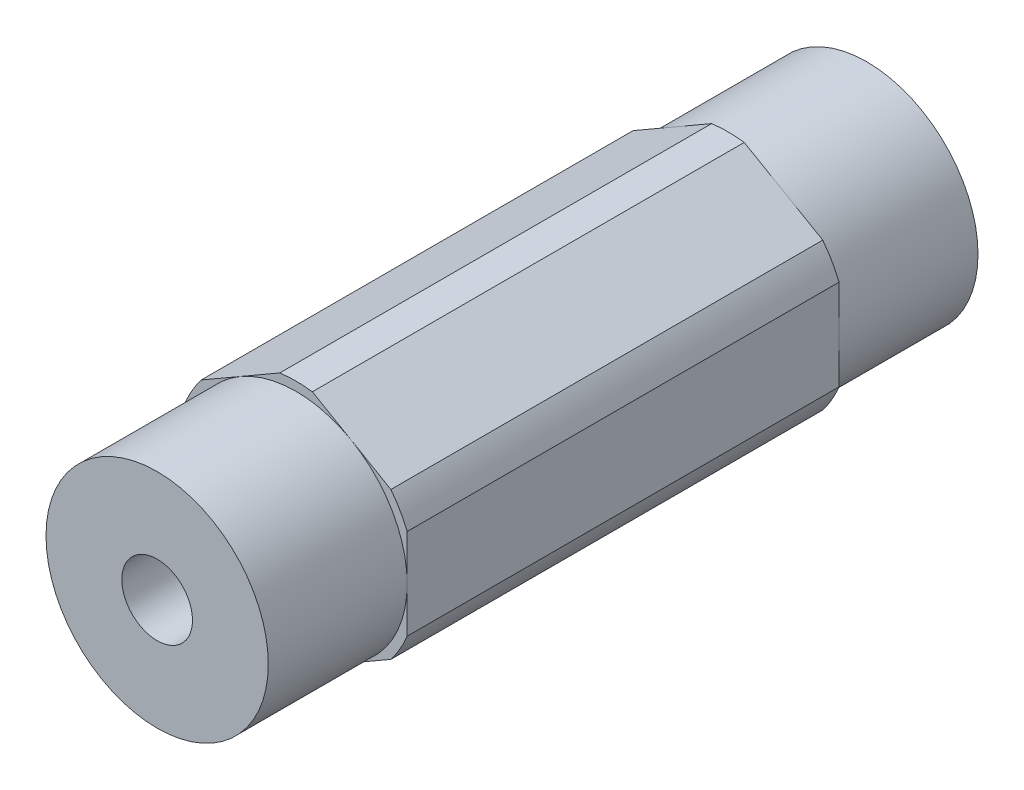
ISO-10303-21;
HEADER;
FILE_DESCRIPTION(('STEP AP214'),'2;1');
FILE_NAME('part.step','',(''),(''),'','','');
FILE_SCHEMA(('AUTOMOTIVE_DESIGN { 1 0 10303 214 1 1 1 1 }'));
ENDSEC;
DATA;
#1=APPLICATION_CONTEXT('core data for automotive mechanical design processes');
#2=APPLICATION_PROTOCOL_DEFINITION('international standard','automotive_design',2000,#1);
#3=PRODUCT_CONTEXT('',#1,'mechanical');
#4=PRODUCT('Part','Part','',(#3));
#5=PRODUCT_RELATED_PRODUCT_CATEGORY('part','',(#4));
#6=PRODUCT_DEFINITION_FORMATION('','',#4);
#7=PRODUCT_DEFINITION_CONTEXT('part definition',#1,'design');
#8=PRODUCT_DEFINITION('design','',#6,#7);
#9=PRODUCT_DEFINITION_SHAPE('','',#8);
#10=(LENGTH_UNIT() NAMED_UNIT(*) SI_UNIT(.MILLI.,.METRE.));
#11=(NAMED_UNIT(*) PLANE_ANGLE_UNIT() SI_UNIT($,.RADIAN.));
#12=(NAMED_UNIT(*) SI_UNIT($,.STERADIAN.) SOLID_ANGLE_UNIT());
#13=UNCERTAINTY_MEASURE_WITH_UNIT(LENGTH_MEASURE(1.E-05),#10,'distance_accuracy_value','');
#14=(GEOMETRIC_REPRESENTATION_CONTEXT(3) GLOBAL_UNCERTAINTY_ASSIGNED_CONTEXT((#13)) GLOBAL_UNIT_ASSIGNED_CONTEXT((#10,
#11,#12)) REPRESENTATION_CONTEXT('',''));
#15=CARTESIAN_POINT('',(0.,0.,0.));
#16=DIRECTION('',(0.,0.,1.));
#17=DIRECTION('',(1.,0.,0.));
#18=AXIS2_PLACEMENT_3D('',#15,#16,#17);
#19=CARTESIAN_POINT('',(0.,0.,-12.337299938));
#20=DIRECTION('',(0.,0.,1.));
#21=DIRECTION('',(1.,0.,0.));
#22=AXIS2_PLACEMENT_3D('',#19,#20,#21);
#23=PLANE('',#22);
#24=DIRECTION('',(0.,1.,0.));
#25=VECTOR('',#24,1.);
#26=CARTESIAN_POINT('',(6.35,0.,-12.337299938));
#27=LINE('',#26,#25);
#28=CARTESIAN_POINT('',(6.35,0.,-12.337299938));
#29=VERTEX_POINT('',#28);
#30=CARTESIAN_POINT('',(6.35,2.59030191290514,-12.337299938));
#31=VERTEX_POINT('',#30);
#32=EDGE_CURVE('E219',#29,#31,#27,.T.);
#33=ORIENTED_EDGE('',*,*,#32,.F.);
#34=CARTESIAN_POINT('',(0.,0.,-12.337299938));
#35=DIRECTION('',(0.,0.,1.));
#36=DIRECTION('',(1.,0.,0.));
#37=AXIS2_PLACEMENT_3D('',#34,#35,#36);
#38=CIRCLE('',#37,6.35);
#39=CARTESIAN_POINT('',(3.175,5.49926131403118,-12.337299938));
#40=VERTEX_POINT('',#39);
#41=EDGE_CURVE('E63',#29,#40,#38,.T.);
#42=ORIENTED_EDGE('',*,*,#41,.T.);
#43=DIRECTION('',(-0.866025403784439,0.5,0.));
#44=VECTOR('',#43,1.);
#45=CARTESIAN_POINT('',(3.175,5.49926131403119,-12.337299938));
#46=LINE('',#45,#44);
#47=CARTESIAN_POINT('',(5.41826726004727,4.20411035757862,-12.337299938));
#48=VERTEX_POINT('',#47);
#49=EDGE_CURVE('E271',#48,#40,#46,.T.);
#50=ORIENTED_EDGE('',*,*,#49,.F.);
#51=CARTESIAN_POINT('',(0.,0.,-12.337299938));
#52=DIRECTION('',(0.,0.,1.));
#53=DIRECTION('',(1.,0.,0.));
#54=AXIS2_PLACEMENT_3D('',#51,#52,#53);
#55=CIRCLE('',#54,6.858);
#56=EDGE_CURVE('E265',#31,#48,#55,.T.);
#57=ORIENTED_EDGE('',*,*,#56,.F.);
#58=EDGE_LOOP('',(#33,#42,#50,#57));
#59=FACE_BOUND('',#58,.T.);
#60=ADVANCED_FACE('F51',(#59),#23,.F.);
#61=CARTESIAN_POINT('',(0.931732739952729,6.79441227048375,-12.337299938));
#62=VERTEX_POINT('',#61);
#63=EDGE_CURVE('E268',#40,#62,#46,.T.);
#64=ORIENTED_EDGE('',*,*,#63,.F.);
#65=CARTESIAN_POINT('',(-3.175,5.49926131403118,-12.337299938));
#66=VERTEX_POINT('',#65);
#67=EDGE_CURVE('E11',#40,#66,#38,.T.);
#68=ORIENTED_EDGE('',*,*,#67,.T.);
#69=DIRECTION('',(-0.866025403784438,-0.5,0.));
#70=VECTOR('',#69,1.);
#71=CARTESIAN_POINT('',(-3.175,5.49926131403118,-12.337299938));
#72=LINE('',#71,#70);
#73=CARTESIAN_POINT('',(-0.931732739952722,6.79441227048375,-12.337299938));
#74=VERTEX_POINT('',#73);
#75=EDGE_CURVE('E275',#74,#66,#72,.T.);
#76=ORIENTED_EDGE('',*,*,#75,.F.);
#77=EDGE_CURVE('E270',#62,#74,#55,.T.);
#78=ORIENTED_EDGE('',*,*,#77,.F.);
#79=EDGE_LOOP('',(#64,#68,#76,#78));
#80=FACE_BOUND('',#79,.T.);
#81=ADVANCED_FACE('F437',(#80),#23,.F.);
#82=CARTESIAN_POINT('',(-5.41826726004728,4.20411035757861,-12.337299938));
#83=VERTEX_POINT('',#82);
#84=EDGE_CURVE('E280',#66,#83,#72,.T.);
#85=ORIENTED_EDGE('',*,*,#84,.F.);
#86=CARTESIAN_POINT('',(-6.35,0.,-12.337299938));
#87=VERTEX_POINT('',#86);
#88=EDGE_CURVE('E61',#66,#87,#38,.T.);
#89=ORIENTED_EDGE('',*,*,#88,.T.);
#90=DIRECTION('',(0.,-1.,0.));
#91=VECTOR('',#90,1.);
#92=CARTESIAN_POINT('',(-6.35,0.,-12.337299938));
#93=LINE('',#92,#91);
#94=CARTESIAN_POINT('',(-6.35,2.59030191290514,-12.337299938));
#95=VERTEX_POINT('',#94);
#96=EDGE_CURVE('E281',#95,#87,#93,.T.);
#97=ORIENTED_EDGE('',*,*,#96,.F.);
#98=EDGE_CURVE('E279',#83,#95,#55,.T.);
#99=ORIENTED_EDGE('',*,*,#98,.F.);
#100=EDGE_LOOP('',(#85,#89,#97,#99));
#101=FACE_BOUND('',#100,.T.);
#102=ADVANCED_FACE('F384',(#101),#23,.F.);
#103=CARTESIAN_POINT('',(-6.35,-2.59030191290514,-12.337299938));
#104=VERTEX_POINT('',#103);
#105=EDGE_CURVE('E286',#87,#104,#93,.T.);
#106=ORIENTED_EDGE('',*,*,#105,.F.);
#107=CARTESIAN_POINT('',(-3.175,-5.49926131403119,-12.337299938));
#108=VERTEX_POINT('',#107);
#109=EDGE_CURVE('E370',#87,#108,#38,.T.);
#110=ORIENTED_EDGE('',*,*,#109,.T.);
#111=DIRECTION('',(0.866025403784439,-0.5,0.));
#112=VECTOR('',#111,1.);
#113=CARTESIAN_POINT('',(-3.175,-5.49926131403119,-12.337299938));
#114=LINE('',#113,#112);
#115=CARTESIAN_POINT('',(-5.41826726004727,-4.20411035757862,-12.337299938));
#116=VERTEX_POINT('',#115);
#117=EDGE_CURVE('E287',#116,#108,#114,.T.);
#118=ORIENTED_EDGE('',*,*,#117,.F.);
#119=EDGE_CURVE('E285',#104,#116,#55,.T.);
#120=ORIENTED_EDGE('',*,*,#119,.F.);
#121=EDGE_LOOP('',(#106,#110,#118,#120));
#122=FACE_BOUND('',#121,.T.);
#123=ADVANCED_FACE('F387',(#122),#23,.F.);
#124=CARTESIAN_POINT('',(-0.931732739952726,-6.79441227048375,-12.337299938));
#125=VERTEX_POINT('',#124);
#126=EDGE_CURVE('E292',#108,#125,#114,.T.);
#127=ORIENTED_EDGE('',*,*,#126,.F.);
#128=CARTESIAN_POINT('',(3.175,-5.49926131403118,-12.337299938));
#129=VERTEX_POINT('',#128);
#130=EDGE_CURVE('E363',#108,#129,#38,.T.);
#131=ORIENTED_EDGE('',*,*,#130,.T.);
#132=DIRECTION('',(0.866025403784438,0.5,0.));
#133=VECTOR('',#132,1.);
#134=CARTESIAN_POINT('',(3.175,-5.49926131403118,-12.337299938));
#135=LINE('',#134,#133);
#136=CARTESIAN_POINT('',(0.931732739952725,-6.79441227048375,-12.337299938));
#137=VERTEX_POINT('',#136);
#138=EDGE_CURVE('E293',#137,#129,#135,.T.);
#139=ORIENTED_EDGE('',*,*,#138,.F.);
#140=EDGE_CURVE('E291',#125,#137,#55,.T.);
#141=ORIENTED_EDGE('',*,*,#140,.F.);
#142=EDGE_LOOP('',(#127,#131,#139,#141));
#143=FACE_BOUND('',#142,.T.);
#144=ADVANCED_FACE('F466',(#143),#23,.F.);
#145=CARTESIAN_POINT('',(0.,0.,12.337299938));
#146=DIRECTION('',(0.,0.,1.));
#147=DIRECTION('',(1.,0.,0.));
#148=AXIS2_PLACEMENT_3D('',#145,#146,#147);
#149=PLANE('',#148);
#150=CARTESIAN_POINT('',(0.,0.,12.337299938));
#151=DIRECTION('',(0.,0.,1.));
#152=DIRECTION('',(1.,0.,0.));
#153=AXIS2_PLACEMENT_3D('',#150,#151,#152);
#154=CIRCLE('',#153,6.35);
#155=CARTESIAN_POINT('',(6.35,0.,12.337299938));
#156=VERTEX_POINT('',#155);
#157=CARTESIAN_POINT('',(3.175,5.49926131403119,12.337299938));
#158=VERTEX_POINT('',#157);
#159=EDGE_CURVE('E211',#156,#158,#154,.T.);
#160=ORIENTED_EDGE('',*,*,#159,.F.);
#161=DIRECTION('',(0.,1.,0.));
#162=VECTOR('',#161,1.);
#163=CARTESIAN_POINT('',(6.35,0.,12.337299938));
#164=LINE('',#163,#162);
#165=CARTESIAN_POINT('',(6.35,2.59030191290514,12.337299938));
#166=VERTEX_POINT('',#165);
#167=EDGE_CURVE('E228',#156,#166,#164,.T.);
#168=ORIENTED_EDGE('',*,*,#167,.T.);
#169=CARTESIAN_POINT('',(0.,0.,12.337299938));
#170=DIRECTION('',(0.,0.,1.));
#171=DIRECTION('',(1.,0.,0.));
#172=AXIS2_PLACEMENT_3D('',#169,#170,#171);
#173=CIRCLE('',#172,6.858);
#174=CARTESIAN_POINT('',(5.41826726004727,4.20411035757862,12.337299938));
#175=VERTEX_POINT('',#174);
#176=EDGE_CURVE('E227',#166,#175,#173,.T.);
#177=ORIENTED_EDGE('',*,*,#176,.T.);
#178=DIRECTION('',(-0.866025403784439,0.5,0.));
#179=VECTOR('',#178,1.);
#180=CARTESIAN_POINT('',(3.175,5.49926131403119,12.337299938));
#181=LINE('',#180,#179);
#182=EDGE_CURVE('E234',#175,#158,#181,.T.);
#183=ORIENTED_EDGE('',*,*,#182,.T.);
#184=EDGE_LOOP('',(#160,#168,#177,#183));
#185=FACE_BOUND('',#184,.T.);
#186=ADVANCED_FACE('F418',(#185),#149,.T.);
#187=CARTESIAN_POINT('',(-3.175,5.49926131403118,12.337299938));
#188=VERTEX_POINT('',#187);
#189=EDGE_CURVE('E223',#158,#188,#154,.T.);
#190=ORIENTED_EDGE('',*,*,#189,.F.);
#191=CARTESIAN_POINT('',(0.931732739952729,6.79441227048375,12.337299938));
#192=VERTEX_POINT('',#191);
#193=EDGE_CURVE('E231',#158,#192,#181,.T.);
#194=ORIENTED_EDGE('',*,*,#193,.T.);
#195=CARTESIAN_POINT('',(-0.931732739952722,6.79441227048375,12.337299938));
#196=VERTEX_POINT('',#195);
#197=EDGE_CURVE('E233',#192,#196,#173,.T.);
#198=ORIENTED_EDGE('',*,*,#197,.T.);
#199=DIRECTION('',(-0.866025403784438,-0.5,0.));
#200=VECTOR('',#199,1.);
#201=CARTESIAN_POINT('',(-3.175,5.49926131403118,12.337299938));
#202=LINE('',#201,#200);
#203=EDGE_CURVE('E238',#196,#188,#202,.T.);
#204=ORIENTED_EDGE('',*,*,#203,.T.);
#205=EDGE_LOOP('',(#190,#194,#198,#204));
#206=FACE_BOUND('',#205,.T.);
#207=ADVANCED_FACE('F443',(#206),#149,.T.);
#208=CARTESIAN_POINT('',(-6.35,0.,12.337299938));
#209=VERTEX_POINT('',#208);
#210=EDGE_CURVE('E357',#188,#209,#154,.T.);
#211=ORIENTED_EDGE('',*,*,#210,.F.);
#212=CARTESIAN_POINT('',(-5.41826726004728,4.20411035757861,12.337299938));
#213=VERTEX_POINT('',#212);
#214=EDGE_CURVE('E243',#188,#213,#202,.T.);
#215=ORIENTED_EDGE('',*,*,#214,.T.);
#216=CARTESIAN_POINT('',(-6.35,2.59030191290514,12.337299938));
#217=VERTEX_POINT('',#216);
#218=EDGE_CURVE('E242',#213,#217,#173,.T.);
#219=ORIENTED_EDGE('',*,*,#218,.T.);
#220=DIRECTION('',(0.,-1.,0.));
#221=VECTOR('',#220,1.);
#222=CARTESIAN_POINT('',(-6.35,0.,12.337299938));
#223=LINE('',#222,#221);
#224=EDGE_CURVE('E244',#217,#209,#223,.T.);
#225=ORIENTED_EDGE('',*,*,#224,.T.);
#226=EDGE_LOOP('',(#211,#215,#219,#225));
#227=FACE_BOUND('',#226,.T.);
#228=ADVANCED_FACE('F473',(#227),#149,.T.);
#229=CARTESIAN_POINT('',(-3.175,-5.49926131403119,12.337299938));
#230=VERTEX_POINT('',#229);
#231=EDGE_CURVE('E354',#209,#230,#154,.T.);
#232=ORIENTED_EDGE('',*,*,#231,.F.);
#233=CARTESIAN_POINT('',(-6.35,-2.59030191290514,12.337299938));
#234=VERTEX_POINT('',#233);
#235=EDGE_CURVE('E249',#209,#234,#223,.T.);
#236=ORIENTED_EDGE('',*,*,#235,.T.);
#237=CARTESIAN_POINT('',(-5.41826726004727,-4.20411035757862,12.337299938));
#238=VERTEX_POINT('',#237);
#239=EDGE_CURVE('E248',#234,#238,#173,.T.);
#240=ORIENTED_EDGE('',*,*,#239,.T.);
#241=DIRECTION('',(0.866025403784439,-0.5,0.));
#242=VECTOR('',#241,1.);
#243=CARTESIAN_POINT('',(-3.175,-5.49926131403119,12.337299938));
#244=LINE('',#243,#242);
#245=EDGE_CURVE('E250',#238,#230,#244,.T.);
#246=ORIENTED_EDGE('',*,*,#245,.T.);
#247=EDGE_LOOP('',(#232,#236,#240,#246));
#248=FACE_BOUND('',#247,.T.);
#249=ADVANCED_FACE('F475',(#248),#149,.T.);
#250=CARTESIAN_POINT('',(3.175,-5.49926131403118,12.337299938));
#251=VERTEX_POINT('',#250);
#252=EDGE_CURVE('E350',#230,#251,#154,.T.);
#253=ORIENTED_EDGE('',*,*,#252,.F.);
#254=CARTESIAN_POINT('',(-0.931732739952726,-6.79441227048375,12.337299938));
#255=VERTEX_POINT('',#254);
#256=EDGE_CURVE('E255',#230,#255,#244,.T.);
#257=ORIENTED_EDGE('',*,*,#256,.T.);
#258=CARTESIAN_POINT('',(0.931732739952725,-6.79441227048375,12.337299938));
#259=VERTEX_POINT('',#258);
#260=EDGE_CURVE('E254',#255,#259,#173,.T.);
#261=ORIENTED_EDGE('',*,*,#260,.T.);
#262=DIRECTION('',(0.866025403784438,0.5,0.));
#263=VECTOR('',#262,1.);
#264=CARTESIAN_POINT('',(3.175,-5.49926131403118,12.337299938));
#265=LINE('',#264,#263);
#266=EDGE_CURVE('E256',#259,#251,#265,.T.);
#267=ORIENTED_EDGE('',*,*,#266,.T.);
#268=EDGE_LOOP('',(#253,#257,#261,#267));
#269=FACE_BOUND('',#268,.T.);
#270=ADVANCED_FACE('F481',(#269),#149,.T.);
#271=CARTESIAN_POINT('',(6.35,0.,12.337299938));
#272=DIRECTION('',(-1.,0.,0.));
#273=DIRECTION('',(0.,-1.,0.));
#274=AXIS2_PLACEMENT_3D('',#271,#272,#273);
#275=PLANE('',#274);
#276=CARTESIAN_POINT('',(6.35,-2.59030191290514,-12.337299938));
#277=VERTEX_POINT('',#276);
#278=EDGE_CURVE('E261',#277,#29,#27,.T.);
#279=ORIENTED_EDGE('',*,*,#278,.T.);
#280=ORIENTED_EDGE('',*,*,#32,.T.);
#281=DIRECTION('',(0.,0.,-1.));
#282=VECTOR('',#281,1.);
#283=CARTESIAN_POINT('',(6.35,2.59030191290514,12.337299938));
#284=LINE('',#283,#282);
#285=EDGE_CURVE('E55',#166,#31,#284,.T.);
#286=ORIENTED_EDGE('',*,*,#285,.F.);
#287=ORIENTED_EDGE('',*,*,#167,.F.);
#288=CARTESIAN_POINT('',(6.35,-2.59030191290514,12.337299938));
#289=VERTEX_POINT('',#288);
#290=EDGE_CURVE('E224',#289,#156,#164,.T.);
#291=ORIENTED_EDGE('',*,*,#290,.F.);
#292=DIRECTION('',(0.,0.,-1.));
#293=VECTOR('',#292,1.);
#294=CARTESIAN_POINT('',(6.35,-2.59030191290514,12.337299938));
#295=LINE('',#294,#293);
#296=EDGE_CURVE('E298',#289,#277,#295,.T.);
#297=ORIENTED_EDGE('',*,*,#296,.T.);
#298=EDGE_LOOP('',(#279,#280,#286,#287,#291,#297));
#299=FACE_BOUND('',#298,.T.);
#300=ADVANCED_FACE('F53',(#299),#275,.F.);
#301=CARTESIAN_POINT('',(0.,0.,12.337299938));
#302=DIRECTION('',(0.,0.,-1.));
#303=DIRECTION('',(-1.,0.,0.));
#304=AXIS2_PLACEMENT_3D('',#301,#302,#303);
#305=CYLINDRICAL_SURFACE('',#304,6.858);
#306=ORIENTED_EDGE('',*,*,#56,.T.);
#307=DIRECTION('',(0.,0.,-1.));
#308=VECTOR('',#307,1.);
#309=CARTESIAN_POINT('',(5.41826726004727,4.20411035757862,12.337299938));
#310=LINE('',#309,#308);
#311=EDGE_CURVE('E337',#175,#48,#310,.T.);
#312=ORIENTED_EDGE('',*,*,#311,.F.);
#313=ORIENTED_EDGE('',*,*,#176,.F.);
#314=ORIENTED_EDGE('',*,*,#285,.T.);
#315=EDGE_LOOP('',(#306,#312,#313,#314));
#316=FACE_BOUND('',#315,.T.);
#317=ADVANCED_FACE('F421',(#316),#305,.T.);
#318=CARTESIAN_POINT('',(3.175,5.49926131403119,12.337299938));
#319=DIRECTION('',(-0.5,-0.866025403784439,0.));
#320=DIRECTION('',(0.866025403784439,-0.5,0.));
#321=AXIS2_PLACEMENT_3D('',#318,#319,#320);
#322=PLANE('',#321);
#323=ORIENTED_EDGE('',*,*,#49,.T.);
#324=ORIENTED_EDGE('',*,*,#63,.T.);
#325=DIRECTION('',(0.,0.,-1.));
#326=VECTOR('',#325,1.);
#327=CARTESIAN_POINT('',(0.931732739952729,6.79441227048375,12.337299938));
#328=LINE('',#327,#326);
#329=EDGE_CURVE('E334',#192,#62,#328,.T.);
#330=ORIENTED_EDGE('',*,*,#329,.F.);
#331=ORIENTED_EDGE('',*,*,#193,.F.);
#332=ORIENTED_EDGE('',*,*,#182,.F.);
#333=ORIENTED_EDGE('',*,*,#311,.T.);
#334=EDGE_LOOP('',(#323,#324,#330,#331,#332,#333));
#335=FACE_BOUND('',#334,.T.);
#336=ADVANCED_FACE('F426',(#335),#322,.F.);
#337=ORIENTED_EDGE('',*,*,#77,.T.);
#338=DIRECTION('',(0.,0.,-1.));
#339=VECTOR('',#338,1.);
#340=CARTESIAN_POINT('',(-0.931732739952722,6.79441227048375,12.337299938));
#341=LINE('',#340,#339);
#342=EDGE_CURVE('E330',#196,#74,#341,.T.);
#343=ORIENTED_EDGE('',*,*,#342,.F.);
#344=ORIENTED_EDGE('',*,*,#197,.F.);
#345=ORIENTED_EDGE('',*,*,#329,.T.);
#346=EDGE_LOOP('',(#337,#343,#344,#345));
#347=FACE_BOUND('',#346,.T.);
#348=ADVANCED_FACE('F434',(#347),#305,.T.);
#349=CARTESIAN_POINT('',(-3.175,5.49926131403118,12.337299938));
#350=DIRECTION('',(0.5,-0.866025403784438,0.));
#351=DIRECTION('',(0.866025403784438,0.5,0.));
#352=AXIS2_PLACEMENT_3D('',#349,#350,#351);
#353=PLANE('',#352);
#354=ORIENTED_EDGE('',*,*,#75,.T.);
#355=ORIENTED_EDGE('',*,*,#84,.T.);
#356=DIRECTION('',(0.,0.,-1.));
#357=VECTOR('',#356,1.);
#358=CARTESIAN_POINT('',(-5.41826726004728,4.20411035757861,12.337299938));
#359=LINE('',#358,#357);
#360=EDGE_CURVE('E326',#213,#83,#359,.T.);
#361=ORIENTED_EDGE('',*,*,#360,.F.);
#362=ORIENTED_EDGE('',*,*,#214,.F.);
#363=ORIENTED_EDGE('',*,*,#203,.F.);
#364=ORIENTED_EDGE('',*,*,#342,.T.);
#365=EDGE_LOOP('',(#354,#355,#361,#362,#363,#364));
#366=FACE_BOUND('',#365,.T.);
#367=ADVANCED_FACE('F439',(#366),#353,.F.);
#368=ORIENTED_EDGE('',*,*,#98,.T.);
#369=DIRECTION('',(0.,0.,-1.));
#370=VECTOR('',#369,1.);
#371=CARTESIAN_POINT('',(-6.35,2.59030191290514,12.337299938));
#372=LINE('',#371,#370);
#373=EDGE_CURVE('E322',#217,#95,#372,.T.);
#374=ORIENTED_EDGE('',*,*,#373,.F.);
#375=ORIENTED_EDGE('',*,*,#218,.F.);
#376=ORIENTED_EDGE('',*,*,#360,.T.);
#377=EDGE_LOOP('',(#368,#374,#375,#376));
#378=FACE_BOUND('',#377,.T.);
#379=ADVANCED_FACE('F397',(#378),#305,.T.);
#380=CARTESIAN_POINT('',(-6.35,0.,12.337299938));
#381=DIRECTION('',(1.,0.,0.));
#382=DIRECTION('',(0.,1.,0.));
#383=AXIS2_PLACEMENT_3D('',#380,#381,#382);
#384=PLANE('',#383);
#385=ORIENTED_EDGE('',*,*,#96,.T.);
#386=ORIENTED_EDGE('',*,*,#105,.T.);
#387=DIRECTION('',(0.,0.,-1.));
#388=VECTOR('',#387,1.);
#389=CARTESIAN_POINT('',(-6.35,-2.59030191290514,12.337299938));
#390=LINE('',#389,#388);
#391=EDGE_CURVE('E318',#234,#104,#390,.T.);
#392=ORIENTED_EDGE('',*,*,#391,.F.);
#393=ORIENTED_EDGE('',*,*,#235,.F.);
#394=ORIENTED_EDGE('',*,*,#224,.F.);
#395=ORIENTED_EDGE('',*,*,#373,.T.);
#396=EDGE_LOOP('',(#385,#386,#392,#393,#394,#395));
#397=FACE_BOUND('',#396,.T.);
#398=ADVANCED_FACE('F391',(#397),#384,.F.);
#399=ORIENTED_EDGE('',*,*,#119,.T.);
#400=DIRECTION('',(0.,0.,-1.));
#401=VECTOR('',#400,1.);
#402=CARTESIAN_POINT('',(-5.41826726004727,-4.20411035757862,12.337299938));
#403=LINE('',#402,#401);
#404=EDGE_CURVE('E314',#238,#116,#403,.T.);
#405=ORIENTED_EDGE('',*,*,#404,.F.);
#406=ORIENTED_EDGE('',*,*,#239,.F.);
#407=ORIENTED_EDGE('',*,*,#391,.T.);
#408=EDGE_LOOP('',(#399,#405,#406,#407));
#409=FACE_BOUND('',#408,.T.);
#410=ADVANCED_FACE('F472',(#409),#305,.T.);
#411=CARTESIAN_POINT('',(-3.175,-5.49926131403119,12.337299938));
#412=DIRECTION('',(0.5,0.866025403784439,0.));
#413=DIRECTION('',(-0.866025403784439,0.5,0.));
#414=AXIS2_PLACEMENT_3D('',#411,#412,#413);
#415=PLANE('',#414);
#416=ORIENTED_EDGE('',*,*,#117,.T.);
#417=ORIENTED_EDGE('',*,*,#126,.T.);
#418=DIRECTION('',(0.,0.,-1.));
#419=VECTOR('',#418,1.);
#420=CARTESIAN_POINT('',(-0.931732739952726,-6.79441227048375,12.337299938));
#421=LINE('',#420,#419);
#422=EDGE_CURVE('E310',#255,#125,#421,.T.);
#423=ORIENTED_EDGE('',*,*,#422,.F.);
#424=ORIENTED_EDGE('',*,*,#256,.F.);
#425=ORIENTED_EDGE('',*,*,#245,.F.);
#426=ORIENTED_EDGE('',*,*,#404,.T.);
#427=EDGE_LOOP('',(#416,#417,#423,#424,#425,#426));
#428=FACE_BOUND('',#427,.T.);
#429=ADVANCED_FACE('F469',(#428),#415,.F.);
#430=ORIENTED_EDGE('',*,*,#140,.T.);
#431=DIRECTION('',(0.,0.,-1.));
#432=VECTOR('',#431,1.);
#433=CARTESIAN_POINT('',(0.931732739952725,-6.79441227048375,12.337299938));
#434=LINE('',#433,#432);
#435=EDGE_CURVE('E306',#259,#137,#434,.T.);
#436=ORIENTED_EDGE('',*,*,#435,.F.);
#437=ORIENTED_EDGE('',*,*,#260,.F.);
#438=ORIENTED_EDGE('',*,*,#422,.T.);
#439=EDGE_LOOP('',(#430,#436,#437,#438));
#440=FACE_BOUND('',#439,.T.);
#441=ADVANCED_FACE('F577',(#440),#305,.T.);
#442=CARTESIAN_POINT('',(3.175,-5.49926131403118,12.337299938));
#443=DIRECTION('',(-0.5,0.866025403784438,0.));
#444=DIRECTION('',(-0.866025403784438,-0.5,0.));
#445=AXIS2_PLACEMENT_3D('',#442,#443,#444);
#446=PLANE('',#445);
#447=ORIENTED_EDGE('',*,*,#138,.T.);
#448=CARTESIAN_POINT('',(5.41826726004728,-4.20411035757861,-12.337299938));
#449=VERTEX_POINT('',#448);
#450=EDGE_CURVE('E297',#129,#449,#135,.T.);
#451=ORIENTED_EDGE('',*,*,#450,.T.);
#452=DIRECTION('',(0.,0.,-1.));
#453=VECTOR('',#452,1.);
#454=CARTESIAN_POINT('',(5.41826726004728,-4.20411035757861,12.337299938));
#455=LINE('',#454,#453);
#456=CARTESIAN_POINT('',(5.41826726004728,-4.20411035757861,12.337299938));
#457=VERTEX_POINT('',#456);
#458=EDGE_CURVE('E302',#457,#449,#455,.T.);
#459=ORIENTED_EDGE('',*,*,#458,.F.);
#460=EDGE_CURVE('E260',#251,#457,#265,.T.);
#461=ORIENTED_EDGE('',*,*,#460,.F.);
#462=ORIENTED_EDGE('',*,*,#266,.F.);
#463=ORIENTED_EDGE('',*,*,#435,.T.);
#464=EDGE_LOOP('',(#447,#451,#459,#461,#462,#463));
#465=FACE_BOUND('',#464,.T.);
#466=ADVANCED_FACE('F464',(#465),#446,.F.);
#467=EDGE_CURVE('E269',#449,#277,#55,.T.);
#468=ORIENTED_EDGE('',*,*,#467,.T.);
#469=ORIENTED_EDGE('',*,*,#296,.F.);
#470=EDGE_CURVE('E232',#457,#289,#173,.T.);
#471=ORIENTED_EDGE('',*,*,#470,.F.);
#472=ORIENTED_EDGE('',*,*,#458,.T.);
#473=EDGE_LOOP('',(#468,#469,#471,#472));
#474=FACE_BOUND('',#473,.T.);
#475=ADVANCED_FACE('F461',(#474),#305,.T.);
#476=EDGE_CURVE('E77',#251,#156,#154,.T.);
#477=ORIENTED_EDGE('',*,*,#476,.F.);
#478=ORIENTED_EDGE('',*,*,#460,.T.);
#479=ORIENTED_EDGE('',*,*,#470,.T.);
#480=ORIENTED_EDGE('',*,*,#290,.T.);
#481=EDGE_LOOP('',(#477,#478,#479,#480));
#482=FACE_BOUND('',#481,.T.);
#483=ADVANCED_FACE('F459',(#482),#149,.T.);
#484=ORIENTED_EDGE('',*,*,#450,.F.);
#485=EDGE_CURVE('E214',#129,#29,#38,.T.);
#486=ORIENTED_EDGE('',*,*,#485,.T.);
#487=ORIENTED_EDGE('',*,*,#278,.F.);
#488=ORIENTED_EDGE('',*,*,#467,.F.);
#489=EDGE_LOOP('',(#484,#486,#487,#488));
#490=FACE_BOUND('',#489,.T.);
#491=ADVANCED_FACE('F462',(#490),#23,.F.);
#492=CARTESIAN_POINT('',(0.,0.,20.274799938));
#493=DIRECTION('',(0.,0.,-1.));
#494=DIRECTION('',(-1.,0.,0.));
#495=AXIS2_PLACEMENT_3D('',#492,#493,#494);
#496=CYLINDRICAL_SURFACE('',#495,6.35);
#497=CARTESIAN_POINT('',(0.,0.,20.274799938));
#498=DIRECTION('',(0.,0.,1.));
#499=DIRECTION('',(1.,0.,0.));
#500=AXIS2_PLACEMENT_3D('',#497,#498,#499);
#501=CIRCLE('',#500,6.35);
#502=CARTESIAN_POINT('',(6.35,0.,20.274799938));
#503=VERTEX_POINT('',#502);
#504=EDGE_CURVE('E215',#503,#503,#501,.T.);
#505=ORIENTED_EDGE('',*,*,#504,.F.);
#506=EDGE_LOOP('',(#505));
#507=FACE_BOUND('',#506,.T.);
#508=ORIENTED_EDGE('',*,*,#159,.T.);
#509=ORIENTED_EDGE('',*,*,#189,.T.);
#510=ORIENTED_EDGE('',*,*,#210,.T.);
#511=ORIENTED_EDGE('',*,*,#231,.T.);
#512=ORIENTED_EDGE('',*,*,#252,.T.);
#513=ORIENTED_EDGE('',*,*,#476,.T.);
#514=EDGE_LOOP('',(#508,#509,#510,#511,#512,#513));
#515=FACE_BOUND('',#514,.T.);
#516=ADVANCED_FACE('F490',(#507,#515),#496,.T.);
#517=CARTESIAN_POINT('',(0.,0.,20.274799938));
#518=DIRECTION('',(0.,0.,1.));
#519=DIRECTION('',(1.,0.,0.));
#520=AXIS2_PLACEMENT_3D('',#517,#518,#519);
#521=PLANE('',#520);
#522=CARTESIAN_POINT('',(0.,0.,20.274799938));
#523=DIRECTION('',(0.,0.,1.));
#524=DIRECTION('',(1.,0.,0.));
#525=AXIS2_PLACEMENT_3D('',#522,#523,#524);
#526=CIRCLE('',#525,2.01929999999999);
#527=CARTESIAN_POINT('',(2.01929999999999,0.,20.274799938));
#528=VERTEX_POINT('',#527);
#529=EDGE_CURVE('E195',#528,#528,#526,.T.);
#530=ORIENTED_EDGE('',*,*,#529,.F.);
#531=EDGE_LOOP('',(#530));
#532=FACE_BOUND('',#531,.T.);
#533=ORIENTED_EDGE('',*,*,#504,.T.);
#534=EDGE_LOOP('',(#533));
#535=FACE_BOUND('',#534,.T.);
#536=ADVANCED_FACE('F495',(#532,#535),#521,.T.);
#537=CARTESIAN_POINT('',(0.,0.,-20.274799938));
#538=DIRECTION('',(0.,0.,1.));
#539=DIRECTION('',(1.,0.,0.));
#540=AXIS2_PLACEMENT_3D('',#537,#538,#539);
#541=CYLINDRICAL_SURFACE('',#540,6.35);
#542=CARTESIAN_POINT('',(0.,0.,-20.274799938));
#543=DIRECTION('',(0.,0.,1.));
#544=DIRECTION('',(1.,0.,0.));
#545=AXIS2_PLACEMENT_3D('',#542,#543,#544);
#546=CIRCLE('',#545,6.35);
#547=CARTESIAN_POINT('',(6.35,0.,-20.274799938));
#548=VERTEX_POINT('',#547);
#549=EDGE_CURVE('E208',#548,#548,#546,.T.);
#550=ORIENTED_EDGE('',*,*,#549,.T.);
#551=EDGE_LOOP('',(#550));
#552=FACE_BOUND('',#551,.T.);
#553=ORIENTED_EDGE('',*,*,#41,.F.);
#554=ORIENTED_EDGE('',*,*,#485,.F.);
#555=ORIENTED_EDGE('',*,*,#130,.F.);
#556=ORIENTED_EDGE('',*,*,#109,.F.);
#557=ORIENTED_EDGE('',*,*,#88,.F.);
#558=ORIENTED_EDGE('',*,*,#67,.F.);
#559=EDGE_LOOP('',(#553,#554,#555,#556,#557,#558));
#560=FACE_BOUND('',#559,.T.);
#561=ADVANCED_FACE('F673',(#552,#560),#541,.T.);
#562=CARTESIAN_POINT('',(0.,0.,-20.274799938));
#563=DIRECTION('',(0.,0.,-1.));
#564=DIRECTION('',(1.,0.,0.));
#565=AXIS2_PLACEMENT_3D('',#562,#563,#564);
#566=PLANE('',#565);
#567=CARTESIAN_POINT('',(0.,0.,-20.274799938));
#568=DIRECTION('',(0.,0.,-1.));
#569=DIRECTION('',(-1.,0.,0.));
#570=AXIS2_PLACEMENT_3D('',#567,#568,#569);
#571=CIRCLE('',#570,2.01929999999999);
#572=CARTESIAN_POINT('',(-2.01929999999999,0.,-20.274799938));
#573=VERTEX_POINT('',#572);
#574=EDGE_CURVE('E194',#573,#573,#571,.T.);
#575=ORIENTED_EDGE('',*,*,#574,.F.);
#576=EDGE_LOOP('',(#575));
#577=FACE_BOUND('',#576,.T.);
#578=ORIENTED_EDGE('',*,*,#549,.F.);
#579=EDGE_LOOP('',(#578));
#580=FACE_BOUND('',#579,.T.);
#581=ADVANCED_FACE('F678',(#577,#580),#566,.T.);
#582=CARTESIAN_POINT('',(0.,0.,-5.197359938));
#583=DIRECTION('',(0.,0.,-1.));
#584=DIRECTION('',(-1.,0.,0.));
#585=AXIS2_PLACEMENT_3D('',#582,#583,#584);
#586=CONICAL_SURFACE('',#585,2.01929999999999,1.02974425867665);
#587=CARTESIAN_POINT('',(0.,0.,-3.98404208999765));
#588=VERTEX_POINT('',#587);
#589=VERTEX_LOOP('',#588);
#590=FACE_BOUND('',#589,.T.);
#591=CARTESIAN_POINT('',(0.,0.,-5.197359938));
#592=DIRECTION('',(0.,0.,-1.));
#593=DIRECTION('',(-1.,0.,0.));
#594=AXIS2_PLACEMENT_3D('',#591,#592,#593);
#595=CIRCLE('',#594,2.01929999999999);
#596=CARTESIAN_POINT('',(-2.01929999999999,0.,-5.197359938));
#597=VERTEX_POINT('',#596);
#598=EDGE_CURVE('E200',#597,#597,#595,.T.);
#599=ORIENTED_EDGE('',*,*,#598,.T.);
#600=EDGE_LOOP('',(#599));
#601=FACE_BOUND('',#600,.T.);
#602=ADVANCED_FACE('F700',(#590,#601),#586,.F.);
#603=CARTESIAN_POINT('',(0.,0.,-20.274799938));
#604=DIRECTION('',(0.,0.,-1.));
#605=DIRECTION('',(-1.,0.,0.));
#606=AXIS2_PLACEMENT_3D('',#603,#604,#605);
#607=CYLINDRICAL_SURFACE('',#606,2.01929999999999);
#608=ORIENTED_EDGE('',*,*,#598,.F.);
#609=EDGE_LOOP('',(#608));
#610=FACE_BOUND('',#609,.T.);
#611=ORIENTED_EDGE('',*,*,#574,.T.);
#612=EDGE_LOOP('',(#611));
#613=FACE_BOUND('',#612,.T.);
#614=ADVANCED_FACE('F187',(#610,#613),#607,.F.);
#615=CARTESIAN_POINT('',(0.,0.,5.197359938));
#616=DIRECTION('',(0.,0.,1.));
#617=DIRECTION('',(1.,0.,0.));
#618=AXIS2_PLACEMENT_3D('',#615,#616,#617);
#619=CONICAL_SURFACE('',#618,2.01929999999999,1.02974425867665);
#620=CARTESIAN_POINT('',(0.,0.,3.98404208999765));
#621=VERTEX_POINT('',#620);
#622=VERTEX_LOOP('',#621);
#623=FACE_BOUND('',#622,.T.);
#624=CARTESIAN_POINT('',(0.,0.,5.197359938));
#625=DIRECTION('',(0.,0.,1.));
#626=DIRECTION('',(1.,0.,0.));
#627=AXIS2_PLACEMENT_3D('',#624,#625,#626);
#628=CIRCLE('',#627,2.01929999999999);
#629=CARTESIAN_POINT('',(2.01929999999999,0.,5.197359938));
#630=VERTEX_POINT('',#629);
#631=EDGE_CURVE('E191',#630,#630,#628,.T.);
#632=ORIENTED_EDGE('',*,*,#631,.T.);
#633=EDGE_LOOP('',(#632));
#634=FACE_BOUND('',#633,.T.);
#635=ADVANCED_FACE('F183',(#623,#634),#619,.F.);
#636=CARTESIAN_POINT('',(0.,0.,20.274799938));
#637=DIRECTION('',(0.,0.,1.));
#638=DIRECTION('',(1.,0.,0.));
#639=AXIS2_PLACEMENT_3D('',#636,#637,#638);
#640=CYLINDRICAL_SURFACE('',#639,2.01929999999999);
#641=ORIENTED_EDGE('',*,*,#631,.F.);
#642=EDGE_LOOP('',(#641));
#643=FACE_BOUND('',#642,.T.);
#644=ORIENTED_EDGE('',*,*,#529,.T.);
#645=EDGE_LOOP('',(#644));
#646=FACE_BOUND('',#645,.T.);
#647=ADVANCED_FACE('F186',(#643,#646),#640,.F.);
#648=CLOSED_SHELL('',(#60,#81,#102,#123,#144,#186,#207,#228,#249,#270,#300,#317,#336,#348,#367,
#379,#398,#410,#429,#441,#466,#475,#483,#491,#516,#536,#561,#581,#602,#614,#635,#647));
#649=MANIFOLD_SOLID_BREP('B2',#648);
#650=ADVANCED_BREP_SHAPE_REPRESENTATION('',(#18,#649),#14);
#651=SHAPE_DEFINITION_REPRESENTATION(#9,#650);
ENDSEC;
END-ISO-10303-21;
